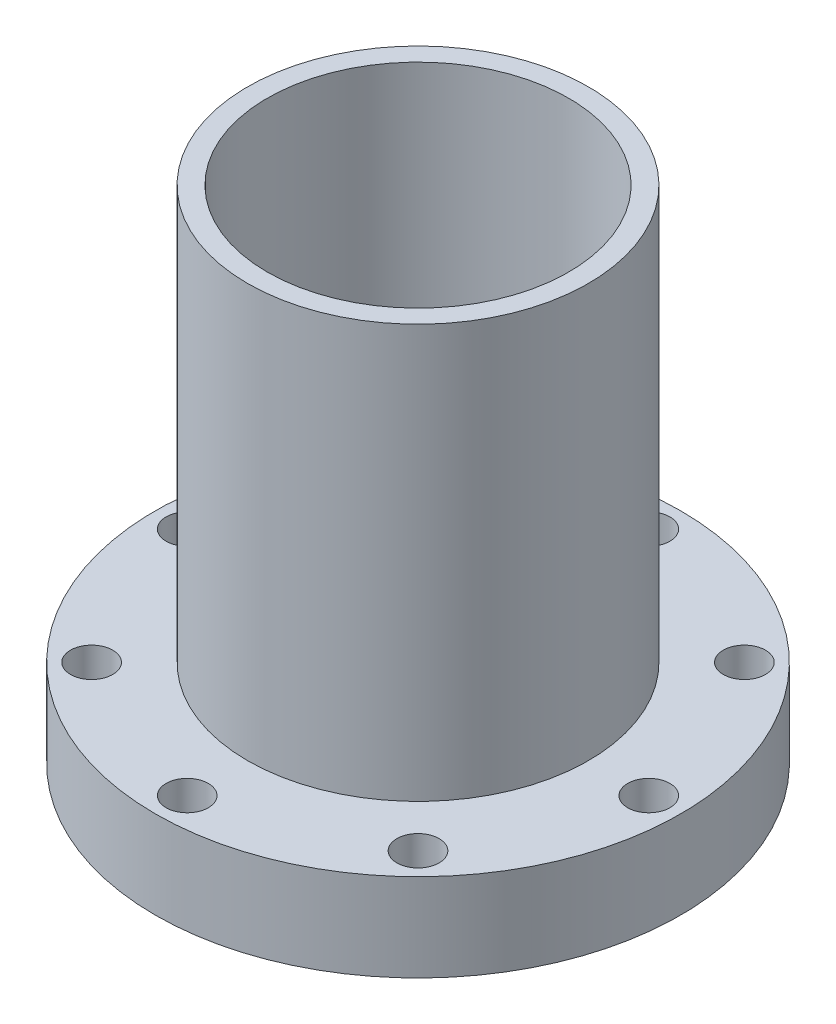
ISO-10303-21;
HEADER;
FILE_DESCRIPTION(('STEP AP214'),'2;1');
FILE_NAME('part.step','',(''),(''),'','','');
FILE_SCHEMA(('AUTOMOTIVE_DESIGN { 1 0 10303 214 1 1 1 1 }'));
ENDSEC;
DATA;
#1=APPLICATION_CONTEXT('core data for automotive mechanical design processes');
#2=APPLICATION_PROTOCOL_DEFINITION('international standard','automotive_design',2000,#1);
#3=PRODUCT_CONTEXT('',#1,'mechanical');
#4=PRODUCT('Part','Part','',(#3));
#5=PRODUCT_RELATED_PRODUCT_CATEGORY('part','',(#4));
#6=PRODUCT_DEFINITION_FORMATION('','',#4);
#7=PRODUCT_DEFINITION_CONTEXT('part definition',#1,'design');
#8=PRODUCT_DEFINITION('design','',#6,#7);
#9=PRODUCT_DEFINITION_SHAPE('','',#8);
#10=(LENGTH_UNIT() NAMED_UNIT(*) SI_UNIT(.MILLI.,.METRE.));
#11=(NAMED_UNIT(*) PLANE_ANGLE_UNIT() SI_UNIT($,.RADIAN.));
#12=(NAMED_UNIT(*) SI_UNIT($,.STERADIAN.) SOLID_ANGLE_UNIT());
#13=UNCERTAINTY_MEASURE_WITH_UNIT(LENGTH_MEASURE(1.E-05),#10,'distance_accuracy_value','');
#14=(GEOMETRIC_REPRESENTATION_CONTEXT(3) GLOBAL_UNCERTAINTY_ASSIGNED_CONTEXT((#13)) GLOBAL_UNIT_ASSIGNED_CONTEXT((#10,
#11,#12)) REPRESENTATION_CONTEXT('',''));
#15=CARTESIAN_POINT('',(0.,0.,0.));
#16=DIRECTION('',(0.,0.,1.));
#17=DIRECTION('',(1.,0.,0.));
#18=AXIS2_PLACEMENT_3D('',#15,#16,#17);
#19=CARTESIAN_POINT('',(0.,-17.526,0.));
#20=DIRECTION('',(0.,1.,0.));
#21=DIRECTION('',(0.,0.,1.));
#22=AXIS2_PLACEMENT_3D('',#19,#20,#21);
#23=PLANE('',#22);
#24=CARTESIAN_POINT('',(-32.2664926729564,-17.526,13.3652188753514));
#25=DIRECTION('',(0.,-1.,0.));
#26=DIRECTION('',(0.,0.,-1.));
#27=AXIS2_PLACEMENT_3D('',#24,#25,#26);
#28=CIRCLE('',#27,2.55269999999999);
#29=CARTESIAN_POINT('',(-32.2664926729564,-17.526,10.8125188753514));
#30=VERTEX_POINT('',#29);
#31=EDGE_CURVE('E82',#30,#30,#28,.T.);
#32=ORIENTED_EDGE('',*,*,#31,.F.);
#33=EDGE_LOOP('',(#32));
#34=FACE_BOUND('',#33,.T.);
#35=CARTESIAN_POINT('',(-13.3652188753512,-17.526,-32.2664926729565));
#36=DIRECTION('',(0.,-1.,0.));
#37=DIRECTION('',(0.,0.,-1.));
#38=AXIS2_PLACEMENT_3D('',#35,#36,#37);
#39=CIRCLE('',#38,2.55269999999999);
#40=CARTESIAN_POINT('',(-13.3652188753512,-17.526,-34.8191926729565));
#41=VERTEX_POINT('',#40);
#42=EDGE_CURVE('E94',#41,#41,#39,.T.);
#43=ORIENTED_EDGE('',*,*,#42,.F.);
#44=EDGE_LOOP('',(#43));
#45=FACE_BOUND('',#44,.T.);
#46=CARTESIAN_POINT('',(32.2664926729565,-17.526,-13.3652188753511));
#47=DIRECTION('',(0.,-1.,0.));
#48=DIRECTION('',(0.,0.,-1.));
#49=AXIS2_PLACEMENT_3D('',#46,#47,#48);
#50=CIRCLE('',#49,2.55269999999999);
#51=CARTESIAN_POINT('',(32.2664926729565,-17.526,-15.9179188753511));
#52=VERTEX_POINT('',#51);
#53=EDGE_CURVE('E106',#52,#52,#50,.T.);
#54=ORIENTED_EDGE('',*,*,#53,.F.);
#55=EDGE_LOOP('',(#54));
#56=FACE_BOUND('',#55,.T.);
#57=CARTESIAN_POINT('',(32.2664926729568,-17.526,13.3652188753504));
#58=DIRECTION('',(0.,-1.,0.));
#59=DIRECTION('',(0.,0.,-1.));
#60=AXIS2_PLACEMENT_3D('',#57,#58,#59);
#61=CIRCLE('',#60,2.55269999999999);
#62=CARTESIAN_POINT('',(32.2664926729568,-17.526,10.8125188753504));
#63=VERTEX_POINT('',#62);
#64=EDGE_CURVE('E112',#63,#63,#61,.T.);
#65=ORIENTED_EDGE('',*,*,#64,.F.);
#66=EDGE_LOOP('',(#65));
#67=FACE_BOUND('',#66,.T.);
#68=CARTESIAN_POINT('',(13.365218875351,-17.526,32.2664926729566));
#69=DIRECTION('',(0.,-1.,0.));
#70=DIRECTION('',(0.,0.,-1.));
#71=AXIS2_PLACEMENT_3D('',#68,#69,#70);
#72=CIRCLE('',#71,2.55269999999999);
#73=CARTESIAN_POINT('',(13.365218875351,-17.526,29.7137926729566));
#74=VERTEX_POINT('',#73);
#75=EDGE_CURVE('E118',#74,#74,#72,.T.);
#76=ORIENTED_EDGE('',*,*,#75,.F.);
#77=EDGE_LOOP('',(#76));
#78=FACE_BOUND('',#77,.T.);
#79=CARTESIAN_POINT('',(32.5983297194806,-17.526,-32.5983297194814));
#80=DIRECTION('',(0.,1.,0.));
#81=DIRECTION('',(-0.707106781186539,0.,0.707106781186556));
#82=AXIS2_PLACEMENT_3D('',#79,#80,#81);
#83=CIRCLE('',#82,4.2164);
#84=CARTESIAN_POINT('',(29.6168846872857,-17.526,-29.6168846872864));
#85=VERTEX_POINT('',#84);
#86=EDGE_CURVE('E122',#85,#85,#83,.T.);
#87=ORIENTED_EDGE('',*,*,#86,.T.);
#88=EDGE_LOOP('',(#87));
#89=FACE_BOUND('',#88,.T.);
#90=CARTESIAN_POINT('',(46.101,-17.526,-4.82882623291511E-13));
#91=DIRECTION('',(0.,1.,0.));
#92=DIRECTION('',(-1.,0.,0.));
#93=AXIS2_PLACEMENT_3D('',#90,#91,#92);
#94=CIRCLE('',#93,4.2164);
#95=CARTESIAN_POINT('',(41.8846,-17.526,-4.38718151960166E-13));
#96=VERTEX_POINT('',#95);
#97=EDGE_CURVE('E128',#96,#96,#94,.T.);
#98=ORIENTED_EDGE('',*,*,#97,.T.);
#99=EDGE_LOOP('',(#98));
#100=FACE_BOUND('',#99,.T.);
#101=CARTESIAN_POINT('',(32.5983297194813,-17.526,32.5983297194807));
#102=DIRECTION('',(0.,1.,0.));
#103=DIRECTION('',(-0.707106781186554,0.,-0.707106781186541));
#104=AXIS2_PLACEMENT_3D('',#101,#102,#103);
#105=CIRCLE('',#104,4.2164);
#106=CARTESIAN_POINT('',(29.6168846872863,-17.526,29.6168846872858));
#107=VERTEX_POINT('',#106);
#108=EDGE_CURVE('E134',#107,#107,#105,.T.);
#109=ORIENTED_EDGE('',*,*,#108,.T.);
#110=EDGE_LOOP('',(#109));
#111=FACE_BOUND('',#110,.T.);
#112=CARTESIAN_POINT('',(3.21921748861007E-13,-17.526,46.101));
#113=DIRECTION('',(0.,1.,0.));
#114=DIRECTION('',(0.,0.,-1.));
#115=AXIS2_PLACEMENT_3D('',#112,#113,#114);
#116=CIRCLE('',#115,4.2164);
#117=CARTESIAN_POINT('',(2.92478767973444E-13,-17.526,41.8846));
#118=VERTEX_POINT('',#117);
#119=EDGE_CURVE('E140',#118,#118,#116,.T.);
#120=ORIENTED_EDGE('',*,*,#119,.T.);
#121=EDGE_LOOP('',(#120));
#122=FACE_BOUND('',#121,.T.);
#123=CARTESIAN_POINT('',(-32.5983297194809,-17.526,32.5983297194812));
#124=DIRECTION('',(0.,1.,0.));
#125=DIRECTION('',(0.707106781186544,0.,-0.707106781186551));
#126=AXIS2_PLACEMENT_3D('',#123,#124,#125);
#127=CIRCLE('',#126,4.2164);
#128=CARTESIAN_POINT('',(-29.6168846872859,-17.526,29.6168846872862));
#129=VERTEX_POINT('',#128);
#130=EDGE_CURVE('E146',#129,#129,#127,.T.);
#131=ORIENTED_EDGE('',*,*,#130,.T.);
#132=EDGE_LOOP('',(#131));
#133=FACE_BOUND('',#132,.T.);
#134=CARTESIAN_POINT('',(-46.101,-17.526,1.60960874430504E-13));
#135=DIRECTION('',(0.,1.,0.));
#136=DIRECTION('',(1.,0.,0.));
#137=AXIS2_PLACEMENT_3D('',#134,#135,#136);
#138=CIRCLE('',#137,4.2164);
#139=CARTESIAN_POINT('',(-41.8846,-17.526,1.46239383986722E-13));
#140=VERTEX_POINT('',#139);
#141=EDGE_CURVE('E152',#140,#140,#138,.T.);
#142=ORIENTED_EDGE('',*,*,#141,.T.);
#143=EDGE_LOOP('',(#142));
#144=FACE_BOUND('',#143,.T.);
#145=CARTESIAN_POINT('',(-32.5983297194811,-17.526,-32.598329719481));
#146=DIRECTION('',(0.,1.,0.));
#147=DIRECTION('',(0.707106781186549,0.,0.707106781186546));
#148=AXIS2_PLACEMENT_3D('',#145,#146,#147);
#149=CIRCLE('',#148,4.2164);
#150=CARTESIAN_POINT('',(-29.6168846872861,-17.526,-29.616884687286));
#151=VERTEX_POINT('',#150);
#152=EDGE_CURVE('E158',#151,#151,#149,.T.);
#153=ORIENTED_EDGE('',*,*,#152,.T.);
#154=EDGE_LOOP('',(#153));
#155=FACE_BOUND('',#154,.T.);
#156=CARTESIAN_POINT('',(0.,-17.526,-46.101));
#157=DIRECTION('',(0.,1.,0.));
#158=DIRECTION('',(0.,0.,1.));
#159=AXIS2_PLACEMENT_3D('',#156,#157,#158);
#160=CIRCLE('',#159,4.2164);
#161=CARTESIAN_POINT('',(0.,-17.526,-41.8846));
#162=VERTEX_POINT('',#161);
#163=EDGE_CURVE('E164',#162,#162,#160,.T.);
#164=ORIENTED_EDGE('',*,*,#163,.T.);
#165=EDGE_LOOP('',(#164));
#166=FACE_BOUND('',#165,.T.);
#167=CARTESIAN_POINT('',(0.,-17.526,0.));
#168=DIRECTION('',(0.,1.,0.));
#169=DIRECTION('',(0.,0.,1.));
#170=AXIS2_PLACEMENT_3D('',#167,#168,#169);
#171=CIRCLE('',#170,30.099);
#172=CARTESIAN_POINT('',(0.,-17.526,30.099));
#173=VERTEX_POINT('',#172);
#174=EDGE_CURVE('E172',#173,#173,#171,.T.);
#175=ORIENTED_EDGE('',*,*,#174,.T.);
#176=EDGE_LOOP('',(#175));
#177=FACE_BOUND('',#176,.T.);
#178=CARTESIAN_POINT('',(0.,-17.526,0.));
#179=DIRECTION('',(0.,1.,0.));
#180=DIRECTION('',(0.,0.,1.));
#181=AXIS2_PLACEMENT_3D('',#178,#179,#180);
#182=CIRCLE('',#181,52.451);
#183=CARTESIAN_POINT('',(0.,-17.526,52.451));
#184=VERTEX_POINT('',#183);
#185=EDGE_CURVE('E176',#184,#184,#182,.T.);
#186=ORIENTED_EDGE('',*,*,#185,.F.);
#187=EDGE_LOOP('',(#186));
#188=FACE_BOUND('',#187,.T.);
#189=CARTESIAN_POINT('',(13.3652188753503,-17.526,-32.2664926729569));
#190=DIRECTION('',(0.,-1.,0.));
#191=DIRECTION('',(0.,0.,-1.));
#192=AXIS2_PLACEMENT_3D('',#189,#190,#191);
#193=CIRCLE('',#192,2.55269999999999);
#194=CARTESIAN_POINT('',(13.3652188753503,-17.526,-34.8191926729569));
#195=VERTEX_POINT('',#194);
#196=EDGE_CURVE('E100',#195,#195,#193,.T.);
#197=ORIENTED_EDGE('',*,*,#196,.F.);
#198=EDGE_LOOP('',(#197));
#199=FACE_BOUND('',#198,.T.);
#200=CARTESIAN_POINT('',(-32.2664926729569,-17.526,-13.3652188753502));
#201=DIRECTION('',(0.,-1.,0.));
#202=DIRECTION('',(0.,0.,-1.));
#203=AXIS2_PLACEMENT_3D('',#200,#201,#202);
#204=CIRCLE('',#203,2.55269999999999);
#205=CARTESIAN_POINT('',(-32.2664926729569,-17.526,-15.9179188753502));
#206=VERTEX_POINT('',#205);
#207=EDGE_CURVE('E88',#206,#206,#204,.T.);
#208=ORIENTED_EDGE('',*,*,#207,.F.);
#209=EDGE_LOOP('',(#208));
#210=FACE_BOUND('',#209,.T.);
#211=CARTESIAN_POINT('',(-13.3652188753501,-17.526,32.266492672957));
#212=DIRECTION('',(0.,-1.,0.));
#213=DIRECTION('',(0.,0.,-1.));
#214=AXIS2_PLACEMENT_3D('',#211,#212,#213);
#215=CIRCLE('',#214,2.55269999999999);
#216=CARTESIAN_POINT('',(-13.3652188753501,-17.526,29.713792672957));
#217=VERTEX_POINT('',#216);
#218=EDGE_CURVE('E74',#217,#217,#215,.T.);
#219=ORIENTED_EDGE('',*,*,#218,.F.);
#220=EDGE_LOOP('',(#219));
#221=FACE_BOUND('',#220,.T.);
#222=ADVANCED_FACE('F32',(#34,#45,#56,#67,#78,#89,#100,#111,#122,#133,#144,#155,#166,#177,#188,
#199,#210,#221),#23,.F.);
#223=CARTESIAN_POINT('',(0.,82.55,0.));
#224=DIRECTION('',(0.,-1.,0.));
#225=DIRECTION('',(0.,0.,-1.));
#226=AXIS2_PLACEMENT_3D('',#223,#224,#225);
#227=CYLINDRICAL_SURFACE('',#226,34.036);
#228=CARTESIAN_POINT('',(0.,82.55,0.));
#229=DIRECTION('',(0.,1.,0.));
#230=DIRECTION('',(0.,0.,1.));
#231=AXIS2_PLACEMENT_3D('',#228,#229,#230);
#232=CIRCLE('',#231,34.036);
#233=CARTESIAN_POINT('',(0.,82.55,34.036));
#234=VERTEX_POINT('',#233);
#235=EDGE_CURVE('E11',#234,#234,#232,.T.);
#236=ORIENTED_EDGE('',*,*,#235,.F.);
#237=EDGE_LOOP('',(#236));
#238=FACE_BOUND('',#237,.T.);
#239=CARTESIAN_POINT('',(0.,0.,0.));
#240=DIRECTION('',(0.,1.,0.));
#241=DIRECTION('',(0.,0.,1.));
#242=AXIS2_PLACEMENT_3D('',#239,#240,#241);
#243=CIRCLE('',#242,34.036);
#244=CARTESIAN_POINT('',(0.,0.,34.036));
#245=VERTEX_POINT('',#244);
#246=EDGE_CURVE('E40',#245,#245,#243,.T.);
#247=ORIENTED_EDGE('',*,*,#246,.T.);
#248=EDGE_LOOP('',(#247));
#249=FACE_BOUND('',#248,.T.);
#250=ADVANCED_FACE('F34',(#238,#249),#227,.T.);
#251=CARTESIAN_POINT('',(0.,82.55,0.));
#252=DIRECTION('',(0.,1.,0.));
#253=DIRECTION('',(0.,0.,1.));
#254=AXIS2_PLACEMENT_3D('',#251,#252,#253);
#255=PLANE('',#254);
#256=CARTESIAN_POINT('',(0.,82.55,0.));
#257=DIRECTION('',(0.,1.,0.));
#258=DIRECTION('',(0.,0.,1.));
#259=AXIS2_PLACEMENT_3D('',#256,#257,#258);
#260=CIRCLE('',#259,30.099);
#261=CARTESIAN_POINT('',(0.,82.55,30.099));
#262=VERTEX_POINT('',#261);
#263=EDGE_CURVE('E167',#262,#262,#260,.T.);
#264=ORIENTED_EDGE('',*,*,#263,.F.);
#265=EDGE_LOOP('',(#264));
#266=FACE_BOUND('',#265,.T.);
#267=ORIENTED_EDGE('',*,*,#235,.T.);
#268=EDGE_LOOP('',(#267));
#269=FACE_BOUND('',#268,.T.);
#270=ADVANCED_FACE('F187',(#266,#269),#255,.T.);
#271=CARTESIAN_POINT('',(0.,0.,0.));
#272=DIRECTION('',(0.,1.,0.));
#273=DIRECTION('',(0.,0.,1.));
#274=AXIS2_PLACEMENT_3D('',#271,#272,#273);
#275=PLANE('',#274);
#276=CARTESIAN_POINT('',(32.5983297194806,0.,-32.5983297194814));
#277=DIRECTION('',(0.,1.,0.));
#278=DIRECTION('',(-0.707106781186539,0.,0.707106781186556));
#279=AXIS2_PLACEMENT_3D('',#276,#277,#278);
#280=CIRCLE('',#279,4.2164);
#281=CARTESIAN_POINT('',(29.6168846872857,0.,-29.6168846872864));
#282=VERTEX_POINT('',#281);
#283=EDGE_CURVE('E121',#282,#282,#280,.T.);
#284=ORIENTED_EDGE('',*,*,#283,.F.);
#285=EDGE_LOOP('',(#284));
#286=FACE_BOUND('',#285,.T.);
#287=CARTESIAN_POINT('',(46.101,0.,-4.82882623291511E-13));
#288=DIRECTION('',(0.,1.,0.));
#289=DIRECTION('',(-1.,0.,0.));
#290=AXIS2_PLACEMENT_3D('',#287,#288,#289);
#291=CIRCLE('',#290,4.2164);
#292=CARTESIAN_POINT('',(41.8846,0.,-4.38718151960166E-13));
#293=VERTEX_POINT('',#292);
#294=EDGE_CURVE('E125',#293,#293,#291,.T.);
#295=ORIENTED_EDGE('',*,*,#294,.F.);
#296=EDGE_LOOP('',(#295));
#297=FACE_BOUND('',#296,.T.);
#298=CARTESIAN_POINT('',(32.5983297194813,0.,32.5983297194807));
#299=DIRECTION('',(0.,1.,0.));
#300=DIRECTION('',(-0.707106781186554,0.,-0.707106781186541));
#301=AXIS2_PLACEMENT_3D('',#298,#299,#300);
#302=CIRCLE('',#301,4.2164);
#303=CARTESIAN_POINT('',(29.6168846872863,0.,29.6168846872858));
#304=VERTEX_POINT('',#303);
#305=EDGE_CURVE('E131',#304,#304,#302,.T.);
#306=ORIENTED_EDGE('',*,*,#305,.F.);
#307=EDGE_LOOP('',(#306));
#308=FACE_BOUND('',#307,.T.);
#309=CARTESIAN_POINT('',(3.21921748861007E-13,0.,46.101));
#310=DIRECTION('',(0.,1.,0.));
#311=DIRECTION('',(0.,0.,-1.));
#312=AXIS2_PLACEMENT_3D('',#309,#310,#311);
#313=CIRCLE('',#312,4.2164);
#314=CARTESIAN_POINT('',(2.92478767973444E-13,0.,41.8846));
#315=VERTEX_POINT('',#314);
#316=EDGE_CURVE('E137',#315,#315,#313,.T.);
#317=ORIENTED_EDGE('',*,*,#316,.F.);
#318=EDGE_LOOP('',(#317));
#319=FACE_BOUND('',#318,.T.);
#320=CARTESIAN_POINT('',(-32.5983297194809,0.,32.5983297194812));
#321=DIRECTION('',(0.,1.,0.));
#322=DIRECTION('',(0.707106781186544,0.,-0.707106781186551));
#323=AXIS2_PLACEMENT_3D('',#320,#321,#322);
#324=CIRCLE('',#323,4.2164);
#325=CARTESIAN_POINT('',(-29.6168846872859,0.,29.6168846872862));
#326=VERTEX_POINT('',#325);
#327=EDGE_CURVE('E143',#326,#326,#324,.T.);
#328=ORIENTED_EDGE('',*,*,#327,.F.);
#329=EDGE_LOOP('',(#328));
#330=FACE_BOUND('',#329,.T.);
#331=CARTESIAN_POINT('',(-46.101,0.,1.60960874430504E-13));
#332=DIRECTION('',(0.,1.,0.));
#333=DIRECTION('',(1.,0.,0.));
#334=AXIS2_PLACEMENT_3D('',#331,#332,#333);
#335=CIRCLE('',#334,4.2164);
#336=CARTESIAN_POINT('',(-41.8846,0.,1.46239383986722E-13));
#337=VERTEX_POINT('',#336);
#338=EDGE_CURVE('E149',#337,#337,#335,.T.);
#339=ORIENTED_EDGE('',*,*,#338,.F.);
#340=EDGE_LOOP('',(#339));
#341=FACE_BOUND('',#340,.T.);
#342=CARTESIAN_POINT('',(-32.5983297194811,0.,-32.598329719481));
#343=DIRECTION('',(0.,1.,0.));
#344=DIRECTION('',(0.707106781186549,0.,0.707106781186546));
#345=AXIS2_PLACEMENT_3D('',#342,#343,#344);
#346=CIRCLE('',#345,4.2164);
#347=CARTESIAN_POINT('',(-29.6168846872861,0.,-29.616884687286));
#348=VERTEX_POINT('',#347);
#349=EDGE_CURVE('E155',#348,#348,#346,.T.);
#350=ORIENTED_EDGE('',*,*,#349,.F.);
#351=EDGE_LOOP('',(#350));
#352=FACE_BOUND('',#351,.T.);
#353=CARTESIAN_POINT('',(0.,0.,-46.101));
#354=DIRECTION('',(0.,1.,0.));
#355=DIRECTION('',(0.,0.,1.));
#356=AXIS2_PLACEMENT_3D('',#353,#354,#355);
#357=CIRCLE('',#356,4.2164);
#358=CARTESIAN_POINT('',(0.,0.,-41.8846));
#359=VERTEX_POINT('',#358);
#360=EDGE_CURVE('E161',#359,#359,#357,.T.);
#361=ORIENTED_EDGE('',*,*,#360,.F.);
#362=EDGE_LOOP('',(#361));
#363=FACE_BOUND('',#362,.T.);
#364=CARTESIAN_POINT('',(0.,0.,0.));
#365=DIRECTION('',(0.,1.,0.));
#366=DIRECTION('',(0.,0.,1.));
#367=AXIS2_PLACEMENT_3D('',#364,#365,#366);
#368=CIRCLE('',#367,52.451);
#369=CARTESIAN_POINT('',(0.,0.,52.451));
#370=VERTEX_POINT('',#369);
#371=EDGE_CURVE('E175',#370,#370,#368,.T.);
#372=ORIENTED_EDGE('',*,*,#371,.T.);
#373=EDGE_LOOP('',(#372));
#374=FACE_BOUND('',#373,.T.);
#375=ORIENTED_EDGE('',*,*,#246,.F.);
#376=EDGE_LOOP('',(#375));
#377=FACE_BOUND('',#376,.T.);
#378=ADVANCED_FACE('F184',(#286,#297,#308,#319,#330,#341,#352,#363,#374,#377),#275,.T.);
#379=CARTESIAN_POINT('',(0.,-17.526,0.));
#380=DIRECTION('',(0.,1.,0.));
#381=DIRECTION('',(0.,0.,1.));
#382=AXIS2_PLACEMENT_3D('',#379,#380,#381);
#383=CYLINDRICAL_SURFACE('',#382,52.451);
#384=ORIENTED_EDGE('',*,*,#185,.T.);
#385=EDGE_LOOP('',(#384));
#386=FACE_BOUND('',#385,.T.);
#387=ORIENTED_EDGE('',*,*,#371,.F.);
#388=EDGE_LOOP('',(#387));
#389=FACE_BOUND('',#388,.T.);
#390=ADVANCED_FACE('F186',(#386,#389),#383,.T.);
#391=CARTESIAN_POINT('',(0.,-17.526,0.));
#392=DIRECTION('',(0.,1.,0.));
#393=DIRECTION('',(0.,0.,1.));
#394=AXIS2_PLACEMENT_3D('',#391,#392,#393);
#395=CYLINDRICAL_SURFACE('',#394,30.099);
#396=ORIENTED_EDGE('',*,*,#174,.F.);
#397=EDGE_LOOP('',(#396));
#398=FACE_BOUND('',#397,.T.);
#399=ORIENTED_EDGE('',*,*,#263,.T.);
#400=EDGE_LOOP('',(#399));
#401=FACE_BOUND('',#400,.T.);
#402=ADVANCED_FACE('F194',(#398,#401),#395,.F.);
#403=CARTESIAN_POINT('',(0.,-17.526,-46.101));
#404=DIRECTION('',(0.,1.,0.));
#405=DIRECTION('',(0.,0.,1.));
#406=AXIS2_PLACEMENT_3D('',#403,#404,#405);
#407=CYLINDRICAL_SURFACE('',#406,4.2164);
#408=ORIENTED_EDGE('',*,*,#163,.F.);
#409=EDGE_LOOP('',(#408));
#410=FACE_BOUND('',#409,.T.);
#411=ORIENTED_EDGE('',*,*,#360,.T.);
#412=EDGE_LOOP('',(#411));
#413=FACE_BOUND('',#412,.T.);
#414=ADVANCED_FACE('F212',(#410,#413),#407,.F.);
#415=CARTESIAN_POINT('',(-32.5983297194811,-17.526,-32.598329719481));
#416=DIRECTION('',(0.,1.,0.));
#417=DIRECTION('',(0.,0.,1.));
#418=AXIS2_PLACEMENT_3D('',#415,#416,#417);
#419=CYLINDRICAL_SURFACE('',#418,4.2164);
#420=ORIENTED_EDGE('',*,*,#152,.F.);
#421=EDGE_LOOP('',(#420));
#422=FACE_BOUND('',#421,.T.);
#423=ORIENTED_EDGE('',*,*,#349,.T.);
#424=EDGE_LOOP('',(#423));
#425=FACE_BOUND('',#424,.T.);
#426=ADVANCED_FACE('F216',(#422,#425),#419,.F.);
#427=CARTESIAN_POINT('',(-46.101,-17.526,1.60960874430504E-13));
#428=DIRECTION('',(0.,1.,0.));
#429=DIRECTION('',(0.,0.,1.));
#430=AXIS2_PLACEMENT_3D('',#427,#428,#429);
#431=CYLINDRICAL_SURFACE('',#430,4.2164);
#432=ORIENTED_EDGE('',*,*,#141,.F.);
#433=EDGE_LOOP('',(#432));
#434=FACE_BOUND('',#433,.T.);
#435=ORIENTED_EDGE('',*,*,#338,.T.);
#436=EDGE_LOOP('',(#435));
#437=FACE_BOUND('',#436,.T.);
#438=ADVANCED_FACE('F220',(#434,#437),#431,.F.);
#439=CARTESIAN_POINT('',(-32.5983297194809,-17.526,32.5983297194812));
#440=DIRECTION('',(0.,1.,0.));
#441=DIRECTION('',(0.,0.,1.));
#442=AXIS2_PLACEMENT_3D('',#439,#440,#441);
#443=CYLINDRICAL_SURFACE('',#442,4.2164);
#444=ORIENTED_EDGE('',*,*,#130,.F.);
#445=EDGE_LOOP('',(#444));
#446=FACE_BOUND('',#445,.T.);
#447=ORIENTED_EDGE('',*,*,#327,.T.);
#448=EDGE_LOOP('',(#447));
#449=FACE_BOUND('',#448,.T.);
#450=ADVANCED_FACE('F224',(#446,#449),#443,.F.);
#451=CARTESIAN_POINT('',(3.21921748861007E-13,-17.526,46.101));
#452=DIRECTION('',(0.,1.,0.));
#453=DIRECTION('',(0.,0.,1.));
#454=AXIS2_PLACEMENT_3D('',#451,#452,#453);
#455=CYLINDRICAL_SURFACE('',#454,4.2164);
#456=ORIENTED_EDGE('',*,*,#119,.F.);
#457=EDGE_LOOP('',(#456));
#458=FACE_BOUND('',#457,.T.);
#459=ORIENTED_EDGE('',*,*,#316,.T.);
#460=EDGE_LOOP('',(#459));
#461=FACE_BOUND('',#460,.T.);
#462=ADVANCED_FACE('F228',(#458,#461),#455,.F.);
#463=CARTESIAN_POINT('',(32.5983297194813,-17.526,32.5983297194807));
#464=DIRECTION('',(0.,1.,0.));
#465=DIRECTION('',(0.,0.,1.));
#466=AXIS2_PLACEMENT_3D('',#463,#464,#465);
#467=CYLINDRICAL_SURFACE('',#466,4.2164);
#468=ORIENTED_EDGE('',*,*,#108,.F.);
#469=EDGE_LOOP('',(#468));
#470=FACE_BOUND('',#469,.T.);
#471=ORIENTED_EDGE('',*,*,#305,.T.);
#472=EDGE_LOOP('',(#471));
#473=FACE_BOUND('',#472,.T.);
#474=ADVANCED_FACE('F232',(#470,#473),#467,.F.);
#475=CARTESIAN_POINT('',(46.101,-17.526,-4.82882623291511E-13));
#476=DIRECTION('',(0.,1.,0.));
#477=DIRECTION('',(0.,0.,1.));
#478=AXIS2_PLACEMENT_3D('',#475,#476,#477);
#479=CYLINDRICAL_SURFACE('',#478,4.2164);
#480=ORIENTED_EDGE('',*,*,#97,.F.);
#481=EDGE_LOOP('',(#480));
#482=FACE_BOUND('',#481,.T.);
#483=ORIENTED_EDGE('',*,*,#294,.T.);
#484=EDGE_LOOP('',(#483));
#485=FACE_BOUND('',#484,.T.);
#486=ADVANCED_FACE('F236',(#482,#485),#479,.F.);
#487=CARTESIAN_POINT('',(32.5983297194806,-17.526,-32.5983297194814));
#488=DIRECTION('',(0.,1.,0.));
#489=DIRECTION('',(0.,0.,1.));
#490=AXIS2_PLACEMENT_3D('',#487,#488,#489);
#491=CYLINDRICAL_SURFACE('',#490,4.2164);
#492=ORIENTED_EDGE('',*,*,#86,.F.);
#493=EDGE_LOOP('',(#492));
#494=FACE_BOUND('',#493,.T.);
#495=ORIENTED_EDGE('',*,*,#283,.T.);
#496=EDGE_LOOP('',(#495));
#497=FACE_BOUND('',#496,.T.);
#498=ADVANCED_FACE('F240',(#494,#497),#491,.F.);
#499=CARTESIAN_POINT('',(13.365218875351,-17.526,32.2664926729566));
#500=DIRECTION('',(0.,-1.,0.));
#501=DIRECTION('',(0.,0.,-1.));
#502=AXIS2_PLACEMENT_3D('',#499,#500,#501);
#503=CYLINDRICAL_SURFACE('',#502,2.55269999999999);
#504=CARTESIAN_POINT('',(13.365218875351,-3.556,32.2664926729566));
#505=DIRECTION('',(0.,-1.,0.));
#506=DIRECTION('',(0.,0.,-1.));
#507=AXIS2_PLACEMENT_3D('',#504,#505,#506);
#508=CIRCLE('',#507,2.5527);
#509=CARTESIAN_POINT('',(13.365218875351,-3.556,29.7137926729566));
#510=VERTEX_POINT('',#509);
#511=EDGE_CURVE('E115',#510,#510,#508,.T.);
#512=ORIENTED_EDGE('',*,*,#511,.F.);
#513=EDGE_LOOP('',(#512));
#514=FACE_BOUND('',#513,.T.);
#515=ORIENTED_EDGE('',*,*,#75,.T.);
#516=EDGE_LOOP('',(#515));
#517=FACE_BOUND('',#516,.T.);
#518=ADVANCED_FACE('F244',(#514,#517),#503,.F.);
#519=CARTESIAN_POINT('',(13.365218875351,-3.556,32.2664926729566));
#520=DIRECTION('',(0.,-1.,0.));
#521=DIRECTION('',(0.,0.,-1.));
#522=AXIS2_PLACEMENT_3D('',#519,#520,#521);
#523=CONICAL_SURFACE('',#522,2.5527,1.02974425867665);
#524=CARTESIAN_POINT('',(13.365218875351,-2.02218309780834,32.2664926729566));
#525=VERTEX_POINT('',#524);
#526=VERTEX_LOOP('',#525);
#527=FACE_BOUND('',#526,.T.);
#528=ORIENTED_EDGE('',*,*,#511,.T.);
#529=EDGE_LOOP('',(#528));
#530=FACE_BOUND('',#529,.T.);
#531=ADVANCED_FACE('F248',(#527,#530),#523,.F.);
#532=CARTESIAN_POINT('',(32.2664926729568,-17.526,13.3652188753504));
#533=DIRECTION('',(0.,-1.,0.));
#534=DIRECTION('',(0.,0.,-1.));
#535=AXIS2_PLACEMENT_3D('',#532,#533,#534);
#536=CYLINDRICAL_SURFACE('',#535,2.55269999999999);
#537=CARTESIAN_POINT('',(32.2664926729568,-3.556,13.3652188753504));
#538=DIRECTION('',(0.,-1.,0.));
#539=DIRECTION('',(0.,0.,-1.));
#540=AXIS2_PLACEMENT_3D('',#537,#538,#539);
#541=CIRCLE('',#540,2.5527);
#542=CARTESIAN_POINT('',(32.2664926729568,-3.556,10.8125188753504));
#543=VERTEX_POINT('',#542);
#544=EDGE_CURVE('E109',#543,#543,#541,.T.);
#545=ORIENTED_EDGE('',*,*,#544,.F.);
#546=EDGE_LOOP('',(#545));
#547=FACE_BOUND('',#546,.T.);
#548=ORIENTED_EDGE('',*,*,#64,.T.);
#549=EDGE_LOOP('',(#548));
#550=FACE_BOUND('',#549,.T.);
#551=ADVANCED_FACE('F252',(#547,#550),#536,.F.);
#552=CARTESIAN_POINT('',(32.2664926729568,-3.556,13.3652188753504));
#553=DIRECTION('',(0.,-1.,0.));
#554=DIRECTION('',(0.,0.,-1.));
#555=AXIS2_PLACEMENT_3D('',#552,#553,#554);
#556=CONICAL_SURFACE('',#555,2.5527,1.02974425867665);
#557=CARTESIAN_POINT('',(32.2664926729568,-2.02218309780834,13.3652188753504));
#558=VERTEX_POINT('',#557);
#559=VERTEX_LOOP('',#558);
#560=FACE_BOUND('',#559,.T.);
#561=ORIENTED_EDGE('',*,*,#544,.T.);
#562=EDGE_LOOP('',(#561));
#563=FACE_BOUND('',#562,.T.);
#564=ADVANCED_FACE('F255',(#560,#563),#556,.F.);
#565=CARTESIAN_POINT('',(32.2664926729565,-17.526,-13.3652188753511));
#566=DIRECTION('',(0.,-1.,0.));
#567=DIRECTION('',(0.,0.,-1.));
#568=AXIS2_PLACEMENT_3D('',#565,#566,#567);
#569=CYLINDRICAL_SURFACE('',#568,2.55269999999999);
#570=CARTESIAN_POINT('',(32.2664926729565,-3.556,-13.3652188753511));
#571=DIRECTION('',(0.,-1.,0.));
#572=DIRECTION('',(0.,0.,-1.));
#573=AXIS2_PLACEMENT_3D('',#570,#571,#572);
#574=CIRCLE('',#573,2.5527);
#575=CARTESIAN_POINT('',(32.2664926729565,-3.556,-15.9179188753511));
#576=VERTEX_POINT('',#575);
#577=EDGE_CURVE('E103',#576,#576,#574,.T.);
#578=ORIENTED_EDGE('',*,*,#577,.F.);
#579=EDGE_LOOP('',(#578));
#580=FACE_BOUND('',#579,.T.);
#581=ORIENTED_EDGE('',*,*,#53,.T.);
#582=EDGE_LOOP('',(#581));
#583=FACE_BOUND('',#582,.T.);
#584=ADVANCED_FACE('F259',(#580,#583),#569,.F.);
#585=CARTESIAN_POINT('',(32.2664926729565,-3.556,-13.3652188753511));
#586=DIRECTION('',(0.,-1.,0.));
#587=DIRECTION('',(0.,0.,-1.));
#588=AXIS2_PLACEMENT_3D('',#585,#586,#587);
#589=CONICAL_SURFACE('',#588,2.5527,1.02974425867665);
#590=CARTESIAN_POINT('',(32.2664926729565,-2.02218309780834,-13.3652188753511));
#591=VERTEX_POINT('',#590);
#592=VERTEX_LOOP('',#591);
#593=FACE_BOUND('',#592,.T.);
#594=ORIENTED_EDGE('',*,*,#577,.T.);
#595=EDGE_LOOP('',(#594));
#596=FACE_BOUND('',#595,.T.);
#597=ADVANCED_FACE('F262',(#593,#596),#589,.F.);
#598=CARTESIAN_POINT('',(13.3652188753503,-17.526,-32.2664926729569));
#599=DIRECTION('',(0.,-1.,0.));
#600=DIRECTION('',(0.,0.,-1.));
#601=AXIS2_PLACEMENT_3D('',#598,#599,#600);
#602=CYLINDRICAL_SURFACE('',#601,2.55269999999999);
#603=CARTESIAN_POINT('',(13.3652188753503,-3.556,-32.2664926729569));
#604=DIRECTION('',(0.,-1.,0.));
#605=DIRECTION('',(0.,0.,-1.));
#606=AXIS2_PLACEMENT_3D('',#603,#604,#605);
#607=CIRCLE('',#606,2.5527);
#608=CARTESIAN_POINT('',(13.3652188753503,-3.556,-34.8191926729569));
#609=VERTEX_POINT('',#608);
#610=EDGE_CURVE('E97',#609,#609,#607,.T.);
#611=ORIENTED_EDGE('',*,*,#610,.F.);
#612=EDGE_LOOP('',(#611));
#613=FACE_BOUND('',#612,.T.);
#614=ORIENTED_EDGE('',*,*,#196,.T.);
#615=EDGE_LOOP('',(#614));
#616=FACE_BOUND('',#615,.T.);
#617=ADVANCED_FACE('F266',(#613,#616),#602,.F.);
#618=CARTESIAN_POINT('',(13.3652188753503,-3.556,-32.2664926729569));
#619=DIRECTION('',(0.,-1.,0.));
#620=DIRECTION('',(0.,0.,-1.));
#621=AXIS2_PLACEMENT_3D('',#618,#619,#620);
#622=CONICAL_SURFACE('',#621,2.5527,1.02974425867665);
#623=CARTESIAN_POINT('',(13.3652188753503,-2.02218309780834,-32.2664926729569));
#624=VERTEX_POINT('',#623);
#625=VERTEX_LOOP('',#624);
#626=FACE_BOUND('',#625,.T.);
#627=ORIENTED_EDGE('',*,*,#610,.T.);
#628=EDGE_LOOP('',(#627));
#629=FACE_BOUND('',#628,.T.);
#630=ADVANCED_FACE('F270',(#626,#629),#622,.F.);
#631=CARTESIAN_POINT('',(-13.3652188753512,-17.526,-32.2664926729565));
#632=DIRECTION('',(0.,-1.,0.));
#633=DIRECTION('',(0.,0.,-1.));
#634=AXIS2_PLACEMENT_3D('',#631,#632,#633);
#635=CYLINDRICAL_SURFACE('',#634,2.55269999999999);
#636=CARTESIAN_POINT('',(-13.3652188753512,-3.556,-32.2664926729565));
#637=DIRECTION('',(0.,-1.,0.));
#638=DIRECTION('',(0.,0.,-1.));
#639=AXIS2_PLACEMENT_3D('',#636,#637,#638);
#640=CIRCLE('',#639,2.5527);
#641=CARTESIAN_POINT('',(-13.3652188753512,-3.556,-34.8191926729565));
#642=VERTEX_POINT('',#641);
#643=EDGE_CURVE('E91',#642,#642,#640,.T.);
#644=ORIENTED_EDGE('',*,*,#643,.F.);
#645=EDGE_LOOP('',(#644));
#646=FACE_BOUND('',#645,.T.);
#647=ORIENTED_EDGE('',*,*,#42,.T.);
#648=EDGE_LOOP('',(#647));
#649=FACE_BOUND('',#648,.T.);
#650=ADVANCED_FACE('F274',(#646,#649),#635,.F.);
#651=CARTESIAN_POINT('',(-13.3652188753512,-3.556,-32.2664926729565));
#652=DIRECTION('',(0.,-1.,0.));
#653=DIRECTION('',(0.,0.,-1.));
#654=AXIS2_PLACEMENT_3D('',#651,#652,#653);
#655=CONICAL_SURFACE('',#654,2.5527,1.02974425867665);
#656=CARTESIAN_POINT('',(-13.3652188753513,-2.02218309780834,-32.2664926729565));
#657=VERTEX_POINT('',#656);
#658=VERTEX_LOOP('',#657);
#659=FACE_BOUND('',#658,.T.);
#660=ORIENTED_EDGE('',*,*,#643,.T.);
#661=EDGE_LOOP('',(#660));
#662=FACE_BOUND('',#661,.T.);
#663=ADVANCED_FACE('F278',(#659,#662),#655,.F.);
#664=CARTESIAN_POINT('',(-32.2664926729569,-17.526,-13.3652188753502));
#665=DIRECTION('',(0.,-1.,0.));
#666=DIRECTION('',(0.,0.,-1.));
#667=AXIS2_PLACEMENT_3D('',#664,#665,#666);
#668=CYLINDRICAL_SURFACE('',#667,2.55269999999999);
#669=CARTESIAN_POINT('',(-32.2664926729569,-3.556,-13.3652188753502));
#670=DIRECTION('',(0.,-1.,0.));
#671=DIRECTION('',(0.,0.,-1.));
#672=AXIS2_PLACEMENT_3D('',#669,#670,#671);
#673=CIRCLE('',#672,2.5527);
#674=CARTESIAN_POINT('',(-32.2664926729569,-3.556,-15.9179188753502));
#675=VERTEX_POINT('',#674);
#676=EDGE_CURVE('E85',#675,#675,#673,.T.);
#677=ORIENTED_EDGE('',*,*,#676,.F.);
#678=EDGE_LOOP('',(#677));
#679=FACE_BOUND('',#678,.T.);
#680=ORIENTED_EDGE('',*,*,#207,.T.);
#681=EDGE_LOOP('',(#680));
#682=FACE_BOUND('',#681,.T.);
#683=ADVANCED_FACE('F282',(#679,#682),#668,.F.);
#684=CARTESIAN_POINT('',(-32.2664926729569,-3.556,-13.3652188753502));
#685=DIRECTION('',(0.,-1.,0.));
#686=DIRECTION('',(0.,0.,-1.));
#687=AXIS2_PLACEMENT_3D('',#684,#685,#686);
#688=CONICAL_SURFACE('',#687,2.5527,1.02974425867665);
#689=CARTESIAN_POINT('',(-32.2664926729569,-2.02218309780834,-13.3652188753502));
#690=VERTEX_POINT('',#689);
#691=VERTEX_LOOP('',#690);
#692=FACE_BOUND('',#691,.T.);
#693=ORIENTED_EDGE('',*,*,#676,.T.);
#694=EDGE_LOOP('',(#693));
#695=FACE_BOUND('',#694,.T.);
#696=ADVANCED_FACE('F286',(#692,#695),#688,.F.);
#697=CARTESIAN_POINT('',(-32.2664926729564,-17.526,13.3652188753514));
#698=DIRECTION('',(0.,-1.,0.));
#699=DIRECTION('',(0.,0.,-1.));
#700=AXIS2_PLACEMENT_3D('',#697,#698,#699);
#701=CYLINDRICAL_SURFACE('',#700,2.55269999999999);
#702=CARTESIAN_POINT('',(-32.2664926729564,-3.556,13.3652188753514));
#703=DIRECTION('',(0.,-1.,0.));
#704=DIRECTION('',(0.,0.,-1.));
#705=AXIS2_PLACEMENT_3D('',#702,#703,#704);
#706=CIRCLE('',#705,2.5527);
#707=CARTESIAN_POINT('',(-32.2664926729564,-3.556,10.8125188753514));
#708=VERTEX_POINT('',#707);
#709=EDGE_CURVE('E77',#708,#708,#706,.T.);
#710=ORIENTED_EDGE('',*,*,#709,.F.);
#711=EDGE_LOOP('',(#710));
#712=FACE_BOUND('',#711,.T.);
#713=ORIENTED_EDGE('',*,*,#31,.T.);
#714=EDGE_LOOP('',(#713));
#715=FACE_BOUND('',#714,.T.);
#716=ADVANCED_FACE('F290',(#712,#715),#701,.F.);
#717=CARTESIAN_POINT('',(-32.2664926729564,-3.556,13.3652188753514));
#718=DIRECTION('',(0.,-1.,0.));
#719=DIRECTION('',(0.,0.,-1.));
#720=AXIS2_PLACEMENT_3D('',#717,#718,#719);
#721=CONICAL_SURFACE('',#720,2.5527,1.02974425867665);
#722=CARTESIAN_POINT('',(-32.2664926729564,-2.02218309780834,13.3652188753514));
#723=VERTEX_POINT('',#722);
#724=VERTEX_LOOP('',#723);
#725=FACE_BOUND('',#724,.T.);
#726=ORIENTED_EDGE('',*,*,#709,.T.);
#727=EDGE_LOOP('',(#726));
#728=FACE_BOUND('',#727,.T.);
#729=ADVANCED_FACE('F294',(#725,#728),#721,.F.);
#730=CARTESIAN_POINT('',(-13.3652188753501,-17.526,32.266492672957));
#731=DIRECTION('',(0.,-1.,0.));
#732=DIRECTION('',(0.,0.,-1.));
#733=AXIS2_PLACEMENT_3D('',#730,#731,#732);
#734=CYLINDRICAL_SURFACE('',#733,2.55269999999999);
#735=CARTESIAN_POINT('',(-13.3652188753501,-3.556,32.266492672957));
#736=DIRECTION('',(0.,-1.,0.));
#737=DIRECTION('',(0.,0.,-1.));
#738=AXIS2_PLACEMENT_3D('',#735,#736,#737);
#739=CIRCLE('',#738,2.5527);
#740=CARTESIAN_POINT('',(-13.3652188753501,-3.556,29.713792672957));
#741=VERTEX_POINT('',#740);
#742=EDGE_CURVE('E72',#741,#741,#739,.T.);
#743=ORIENTED_EDGE('',*,*,#742,.F.);
#744=EDGE_LOOP('',(#743));
#745=FACE_BOUND('',#744,.T.);
#746=ORIENTED_EDGE('',*,*,#218,.T.);
#747=EDGE_LOOP('',(#746));
#748=FACE_BOUND('',#747,.T.);
#749=ADVANCED_FACE('F68',(#745,#748),#734,.F.);
#750=CARTESIAN_POINT('',(-13.3652188753501,-3.556,32.266492672957));
#751=DIRECTION('',(0.,-1.,0.));
#752=DIRECTION('',(0.,0.,-1.));
#753=AXIS2_PLACEMENT_3D('',#750,#751,#752);
#754=CONICAL_SURFACE('',#753,2.5527,1.02974425867665);
#755=CARTESIAN_POINT('',(-13.3652188753501,-2.02218309780834,32.266492672957));
#756=VERTEX_POINT('',#755);
#757=VERTEX_LOOP('',#756);
#758=FACE_BOUND('',#757,.T.);
#759=ORIENTED_EDGE('',*,*,#742,.T.);
#760=EDGE_LOOP('',(#759));
#761=FACE_BOUND('',#760,.T.);
#762=ADVANCED_FACE('F65',(#758,#761),#754,.F.);
#763=CLOSED_SHELL('',(#222,#250,#270,#378,#390,#402,#414,#426,#438,#450,#462,#474,#486,#498,
#518,#531,#551,#564,#584,#597,#617,#630,#650,#663,#683,#696,#716,#729,#749,#762));
#764=MANIFOLD_SOLID_BREP('B2',#763);
#765=ADVANCED_BREP_SHAPE_REPRESENTATION('',(#18,#764),#14);
#766=SHAPE_DEFINITION_REPRESENTATION(#9,#765);
ENDSEC;
END-ISO-10303-21;
